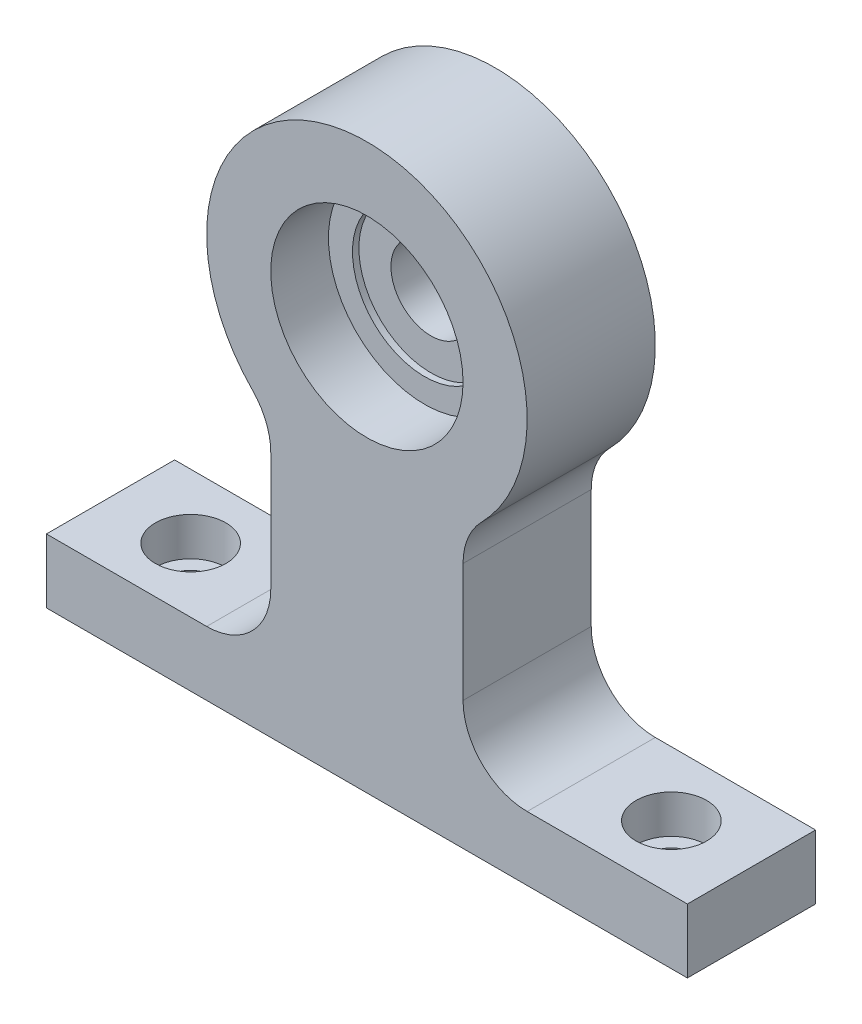
ISO-10303-21;
HEADER;
FILE_DESCRIPTION(('STEP AP214'),'2;1');
FILE_NAME('part.step','',(''),(''),'','','');
FILE_SCHEMA(('AUTOMOTIVE_DESIGN { 1 0 10303 214 1 1 1 1 }'));
ENDSEC;
DATA;
#1=APPLICATION_CONTEXT('core data for automotive mechanical design processes');
#2=APPLICATION_PROTOCOL_DEFINITION('international standard','automotive_design',2000,#1);
#3=PRODUCT_CONTEXT('',#1,'mechanical');
#4=PRODUCT('Part','Part','',(#3));
#5=PRODUCT_RELATED_PRODUCT_CATEGORY('part','',(#4));
#6=PRODUCT_DEFINITION_FORMATION('','',#4);
#7=PRODUCT_DEFINITION_CONTEXT('part definition',#1,'design');
#8=PRODUCT_DEFINITION('design','',#6,#7);
#9=PRODUCT_DEFINITION_SHAPE('','',#8);
#10=(LENGTH_UNIT() NAMED_UNIT(*) SI_UNIT(.MILLI.,.METRE.));
#11=(NAMED_UNIT(*) PLANE_ANGLE_UNIT() SI_UNIT($,.RADIAN.));
#12=(NAMED_UNIT(*) SI_UNIT($,.STERADIAN.) SOLID_ANGLE_UNIT());
#13=UNCERTAINTY_MEASURE_WITH_UNIT(LENGTH_MEASURE(1.E-05),#10,'distance_accuracy_value','');
#14=(GEOMETRIC_REPRESENTATION_CONTEXT(3) GLOBAL_UNCERTAINTY_ASSIGNED_CONTEXT((#13)) GLOBAL_UNIT_ASSIGNED_CONTEXT((#10,
#11,#12)) REPRESENTATION_CONTEXT('',''));
#15=CARTESIAN_POINT('',(0.,0.,0.));
#16=DIRECTION('',(0.,0.,1.));
#17=DIRECTION('',(1.,0.,0.));
#18=AXIS2_PLACEMENT_3D('',#15,#16,#17);
#19=CARTESIAN_POINT('',(0.,63.,0.));
#20=DIRECTION('',(0.,0.,1.));
#21=DIRECTION('',(1.,0.,0.));
#22=AXIS2_PLACEMENT_3D('',#19,#20,#21);
#23=PLANE('',#22);
#24=CARTESIAN_POINT('',(0.,63.,0.));
#25=DIRECTION('',(0.,0.,1.));
#26=DIRECTION('',(1.,0.,0.));
#27=AXIS2_PLACEMENT_3D('',#24,#25,#26);
#28=CIRCLE('',#27,6.25);
#29=CARTESIAN_POINT('',(6.25,63.,0.));
#30=VERTEX_POINT('',#29);
#31=EDGE_CURVE('E360',#30,#30,#28,.T.);
#32=ORIENTED_EDGE('',*,*,#31,.F.);
#33=EDGE_LOOP('',(#32));
#34=FACE_BOUND('',#33,.T.);
#35=CARTESIAN_POINT('',(0.,63.,0.));
#36=DIRECTION('',(0.,0.,1.));
#37=DIRECTION('',(1.,0.,0.));
#38=AXIS2_PLACEMENT_3D('',#35,#36,#37);
#39=CIRCLE('',#38,11.25);
#40=CARTESIAN_POINT('',(11.25,63.,0.));
#41=VERTEX_POINT('',#40);
#42=EDGE_CURVE('E48',#41,#41,#39,.F.);
#43=ORIENTED_EDGE('',*,*,#42,.F.);
#44=EDGE_LOOP('',(#43));
#45=FACE_BOUND('',#44,.T.);
#46=ADVANCED_FACE('F39',(#34,#45),#23,.T.);
#47=CARTESIAN_POINT('',(0.,63.,10.));
#48=DIRECTION('',(0.,0.,1.));
#49=DIRECTION('',(1.,0.,0.));
#50=AXIS2_PLACEMENT_3D('',#47,#48,#49);
#51=PLANE('',#50);
#52=DIRECTION('',(0.,-1.,0.));
#53=VECTOR('',#52,1.);
#54=CARTESIAN_POINT('',(-50.,0.,10.));
#55=LINE('',#54,#53);
#56=CARTESIAN_POINT('',(-50.,10.,10.));
#57=VERTEX_POINT('',#56);
#58=CARTESIAN_POINT('',(-50.,0.,10.));
#59=VERTEX_POINT('',#58);
#60=EDGE_CURVE('E143',#57,#59,#55,.T.);
#61=ORIENTED_EDGE('',*,*,#60,.T.);
#62=DIRECTION('',(1.,0.,0.));
#63=VECTOR('',#62,1.);
#64=CARTESIAN_POINT('',(-50.,0.,10.));
#65=LINE('',#64,#63);
#66=CARTESIAN_POINT('',(50.,0.,10.));
#67=VERTEX_POINT('',#66);
#68=EDGE_CURVE('E131',#59,#67,#65,.T.);
#69=ORIENTED_EDGE('',*,*,#68,.T.);
#70=DIRECTION('',(0.,1.,0.));
#71=VECTOR('',#70,1.);
#72=CARTESIAN_POINT('',(50.,0.,10.));
#73=LINE('',#72,#71);
#74=CARTESIAN_POINT('',(50.,10.,10.));
#75=VERTEX_POINT('',#74);
#76=EDGE_CURVE('E142',#67,#75,#73,.T.);
#77=ORIENTED_EDGE('',*,*,#76,.T.);
#78=DIRECTION('',(-1.,0.,0.));
#79=VECTOR('',#78,1.);
#80=CARTESIAN_POINT('',(15.,10.,10.));
#81=LINE('',#80,#79);
#82=CARTESIAN_POINT('',(25.,10.,10.));
#83=VERTEX_POINT('',#82);
#84=EDGE_CURVE('E330',#75,#83,#81,.T.);
#85=ORIENTED_EDGE('',*,*,#84,.T.);
#86=CARTESIAN_POINT('',(25.,20.,10.));
#87=DIRECTION('',(0.,0.,1.));
#88=DIRECTION('',(1.,0.,0.));
#89=AXIS2_PLACEMENT_3D('',#86,#87,#88);
#90=CIRCLE('',#89,10.);
#91=CARTESIAN_POINT('',(15.,20.,10.));
#92=VERTEX_POINT('',#91);
#93=EDGE_CURVE('E213',#83,#92,#90,.F.);
#94=ORIENTED_EDGE('',*,*,#93,.T.);
#95=DIRECTION('',(0.,1.,0.));
#96=VECTOR('',#95,1.);
#97=CARTESIAN_POINT('',(15.,43.,10.));
#98=LINE('',#97,#96);
#99=CARTESIAN_POINT('',(15.,38.5051025721682,10.));
#100=VERTEX_POINT('',#99);
#101=EDGE_CURVE('E336',#92,#100,#98,.T.);
#102=ORIENTED_EDGE('',*,*,#101,.T.);
#103=CARTESIAN_POINT('',(25.,38.5051025721682,10.));
#104=DIRECTION('',(0.,0.,1.));
#105=DIRECTION('',(1.,0.,0.));
#106=AXIS2_PLACEMENT_3D('',#103,#104,#105);
#107=CIRCLE('',#106,10.);
#108=CARTESIAN_POINT('',(17.8571428571429,45.5036446944059,10.));
#109=VERTEX_POINT('',#108);
#110=EDGE_CURVE('E196',#100,#109,#107,.F.);
#111=ORIENTED_EDGE('',*,*,#110,.T.);
#112=CARTESIAN_POINT('',(0.,63.,10.));
#113=DIRECTION('',(0.,0.,1.));
#114=DIRECTION('',(1.,0.,0.));
#115=AXIS2_PLACEMENT_3D('',#112,#113,#114);
#116=CIRCLE('',#115,25.);
#117=CARTESIAN_POINT('',(-17.8571428571429,45.5036446944059,10.));
#118=VERTEX_POINT('',#117);
#119=EDGE_CURVE('E298',#109,#118,#116,.T.);
#120=ORIENTED_EDGE('',*,*,#119,.T.);
#121=CARTESIAN_POINT('',(-25.,38.5051025721682,10.));
#122=DIRECTION('',(0.,0.,1.));
#123=DIRECTION('',(1.,0.,0.));
#124=AXIS2_PLACEMENT_3D('',#121,#122,#123);
#125=CIRCLE('',#124,10.);
#126=CARTESIAN_POINT('',(-15.,38.5051025721682,10.));
#127=VERTEX_POINT('',#126);
#128=EDGE_CURVE('E202',#118,#127,#125,.F.);
#129=ORIENTED_EDGE('',*,*,#128,.T.);
#130=DIRECTION('',(0.,-1.,0.));
#131=VECTOR('',#130,1.);
#132=CARTESIAN_POINT('',(-15.,43.,10.));
#133=LINE('',#132,#131);
#134=CARTESIAN_POINT('',(-15.,20.,10.));
#135=VERTEX_POINT('',#134);
#136=EDGE_CURVE('E289',#127,#135,#133,.T.);
#137=ORIENTED_EDGE('',*,*,#136,.T.);
#138=CARTESIAN_POINT('',(-25.,20.,10.));
#139=DIRECTION('',(0.,0.,1.));
#140=DIRECTION('',(1.,0.,0.));
#141=AXIS2_PLACEMENT_3D('',#138,#139,#140);
#142=CIRCLE('',#141,10.);
#143=CARTESIAN_POINT('',(-25.,10.,10.));
#144=VERTEX_POINT('',#143);
#145=EDGE_CURVE('E208',#135,#144,#142,.F.);
#146=ORIENTED_EDGE('',*,*,#145,.T.);
#147=DIRECTION('',(-1.,0.,0.));
#148=VECTOR('',#147,1.);
#149=CARTESIAN_POINT('',(-50.,10.,10.));
#150=LINE('',#149,#148);
#151=EDGE_CURVE('E149',#144,#57,#150,.T.);
#152=ORIENTED_EDGE('',*,*,#151,.T.);
#153=EDGE_LOOP('',(#61,#69,#77,#85,#94,#102,#111,#120,#129,#137,#146,#152));
#154=FACE_BOUND('',#153,.T.);
#155=CARTESIAN_POINT('',(0.,63.,10.));
#156=DIRECTION('',(0.,0.,1.));
#157=DIRECTION('',(1.,0.,0.));
#158=AXIS2_PLACEMENT_3D('',#155,#156,#157);
#159=CIRCLE('',#158,15.);
#160=CARTESIAN_POINT('',(15.,63.,10.));
#161=VERTEX_POINT('',#160);
#162=EDGE_CURVE('E305',#161,#161,#159,.T.);
#163=ORIENTED_EDGE('',*,*,#162,.F.);
#164=EDGE_LOOP('',(#163));
#165=FACE_BOUND('',#164,.T.);
#166=ADVANCED_FACE('F146',(#154,#165),#51,.T.);
#167=CARTESIAN_POINT('',(0.,63.,-10.));
#168=DIRECTION('',(0.,0.,1.));
#169=DIRECTION('',(1.,0.,0.));
#170=AXIS2_PLACEMENT_3D('',#167,#168,#169);
#171=PLANE('',#170);
#172=DIRECTION('',(0.,-1.,0.));
#173=VECTOR('',#172,1.);
#174=CARTESIAN_POINT('',(-50.,0.,-10.));
#175=LINE('',#174,#173);
#176=CARTESIAN_POINT('',(-50.,10.,-10.));
#177=VERTEX_POINT('',#176);
#178=CARTESIAN_POINT('',(-50.,0.,-10.));
#179=VERTEX_POINT('',#178);
#180=EDGE_CURVE('E158',#177,#179,#175,.T.);
#181=ORIENTED_EDGE('',*,*,#180,.F.);
#182=DIRECTION('',(-1.,0.,0.));
#183=VECTOR('',#182,1.);
#184=CARTESIAN_POINT('',(-50.,10.,-10.));
#185=LINE('',#184,#183);
#186=CARTESIAN_POINT('',(-25.,10.,-10.));
#187=VERTEX_POINT('',#186);
#188=EDGE_CURVE('E154',#187,#177,#185,.T.);
#189=ORIENTED_EDGE('',*,*,#188,.F.);
#190=CARTESIAN_POINT('',(-25.,20.,-10.));
#191=DIRECTION('',(0.,0.,1.));
#192=DIRECTION('',(1.,0.,0.));
#193=AXIS2_PLACEMENT_3D('',#190,#191,#192);
#194=CIRCLE('',#193,10.);
#195=CARTESIAN_POINT('',(-15.,20.,-10.));
#196=VERTEX_POINT('',#195);
#197=EDGE_CURVE('E205',#187,#196,#194,.T.);
#198=ORIENTED_EDGE('',*,*,#197,.T.);
#199=DIRECTION('',(0.,-1.,0.));
#200=VECTOR('',#199,1.);
#201=CARTESIAN_POINT('',(-15.,43.,-10.));
#202=LINE('',#201,#200);
#203=CARTESIAN_POINT('',(-15.,38.5051025721682,-10.));
#204=VERTEX_POINT('',#203);
#205=EDGE_CURVE('E322',#204,#196,#202,.T.);
#206=ORIENTED_EDGE('',*,*,#205,.F.);
#207=CARTESIAN_POINT('',(-25.,38.5051025721682,-10.));
#208=DIRECTION('',(0.,0.,1.));
#209=DIRECTION('',(1.,0.,0.));
#210=AXIS2_PLACEMENT_3D('',#207,#208,#209);
#211=CIRCLE('',#210,10.);
#212=CARTESIAN_POINT('',(-17.8571428571429,45.5036446944059,-10.));
#213=VERTEX_POINT('',#212);
#214=EDGE_CURVE('E199',#204,#213,#211,.T.);
#215=ORIENTED_EDGE('',*,*,#214,.T.);
#216=CARTESIAN_POINT('',(0.,63.,-10.));
#217=DIRECTION('',(0.,0.,1.));
#218=DIRECTION('',(1.,0.,0.));
#219=AXIS2_PLACEMENT_3D('',#216,#217,#218);
#220=CIRCLE('',#219,25.);
#221=CARTESIAN_POINT('',(17.8571428571429,45.5036446944059,-10.));
#222=VERTEX_POINT('',#221);
#223=EDGE_CURVE('E318',#222,#213,#220,.T.);
#224=ORIENTED_EDGE('',*,*,#223,.F.);
#225=CARTESIAN_POINT('',(25.,38.5051025721682,-10.));
#226=DIRECTION('',(0.,0.,1.));
#227=DIRECTION('',(1.,0.,0.));
#228=AXIS2_PLACEMENT_3D('',#225,#226,#227);
#229=CIRCLE('',#228,10.);
#230=CARTESIAN_POINT('',(15.,38.5051025721682,-10.));
#231=VERTEX_POINT('',#230);
#232=EDGE_CURVE('E193',#222,#231,#229,.T.);
#233=ORIENTED_EDGE('',*,*,#232,.T.);
#234=DIRECTION('',(0.,1.,0.));
#235=VECTOR('',#234,1.);
#236=CARTESIAN_POINT('',(15.,43.,-10.));
#237=LINE('',#236,#235);
#238=CARTESIAN_POINT('',(15.,20.,-10.));
#239=VERTEX_POINT('',#238);
#240=EDGE_CURVE('E314',#239,#231,#237,.T.);
#241=ORIENTED_EDGE('',*,*,#240,.F.);
#242=CARTESIAN_POINT('',(25.,20.,-10.));
#243=DIRECTION('',(0.,0.,1.));
#244=DIRECTION('',(1.,0.,0.));
#245=AXIS2_PLACEMENT_3D('',#242,#243,#244);
#246=CIRCLE('',#245,10.);
#247=CARTESIAN_POINT('',(25.,10.,-10.));
#248=VERTEX_POINT('',#247);
#249=EDGE_CURVE('E63',#239,#248,#246,.T.);
#250=ORIENTED_EDGE('',*,*,#249,.T.);
#251=DIRECTION('',(-1.,0.,0.));
#252=VECTOR('',#251,1.);
#253=CARTESIAN_POINT('',(15.,10.,-10.));
#254=LINE('',#253,#252);
#255=CARTESIAN_POINT('',(50.,10.,-10.));
#256=VERTEX_POINT('',#255);
#257=EDGE_CURVE('E311',#256,#248,#254,.T.);
#258=ORIENTED_EDGE('',*,*,#257,.F.);
#259=DIRECTION('',(0.,1.,0.));
#260=VECTOR('',#259,1.);
#261=CARTESIAN_POINT('',(50.,0.,-10.));
#262=LINE('',#261,#260);
#263=CARTESIAN_POINT('',(50.,0.,-10.));
#264=VERTEX_POINT('',#263);
#265=EDGE_CURVE('E308',#264,#256,#262,.T.);
#266=ORIENTED_EDGE('',*,*,#265,.F.);
#267=DIRECTION('',(1.,0.,0.));
#268=VECTOR('',#267,1.);
#269=CARTESIAN_POINT('',(-50.,0.,-10.));
#270=LINE('',#269,#268);
#271=EDGE_CURVE('E304',#179,#264,#270,.T.);
#272=ORIENTED_EDGE('',*,*,#271,.F.);
#273=EDGE_LOOP('',(#181,#189,#198,#206,#215,#224,#233,#241,#250,#258,#266,#272));
#274=FACE_BOUND('',#273,.T.);
#275=CARTESIAN_POINT('',(0.,63.,-10.));
#276=DIRECTION('',(0.,0.,1.));
#277=DIRECTION('',(1.,0.,0.));
#278=AXIS2_PLACEMENT_3D('',#275,#276,#277);
#279=CIRCLE('',#278,6.25);
#280=CARTESIAN_POINT('',(6.25,63.,-10.));
#281=VERTEX_POINT('',#280);
#282=EDGE_CURVE('E359',#281,#281,#279,.T.);
#283=ORIENTED_EDGE('',*,*,#282,.T.);
#284=EDGE_LOOP('',(#283));
#285=FACE_BOUND('',#284,.T.);
#286=ADVANCED_FACE('F227',(#274,#285),#171,.F.);
#287=CARTESIAN_POINT('',(-50.,0.,10.));
#288=DIRECTION('',(1.,0.,0.));
#289=DIRECTION('',(0.,0.,-1.));
#290=AXIS2_PLACEMENT_3D('',#287,#288,#289);
#291=PLANE('',#290);
#292=ORIENTED_EDGE('',*,*,#180,.T.);
#293=DIRECTION('',(0.,0.,-1.));
#294=VECTOR('',#293,1.);
#295=CARTESIAN_POINT('',(-50.,0.,10.));
#296=LINE('',#295,#294);
#297=EDGE_CURVE('E135',#59,#179,#296,.T.);
#298=ORIENTED_EDGE('',*,*,#297,.F.);
#299=ORIENTED_EDGE('',*,*,#60,.F.);
#300=DIRECTION('',(0.,0.,-1.));
#301=VECTOR('',#300,1.);
#302=CARTESIAN_POINT('',(-50.,10.,10.));
#303=LINE('',#302,#301);
#304=EDGE_CURVE('E292',#57,#177,#303,.T.);
#305=ORIENTED_EDGE('',*,*,#304,.T.);
#306=EDGE_LOOP('',(#292,#298,#299,#305));
#307=FACE_BOUND('',#306,.T.);
#308=ADVANCED_FACE('F156',(#307),#291,.F.);
#309=CARTESIAN_POINT('',(-50.,0.,10.));
#310=DIRECTION('',(0.,1.,0.));
#311=DIRECTION('',(-1.,0.,0.));
#312=AXIS2_PLACEMENT_3D('',#309,#310,#311);
#313=PLANE('',#312);
#314=CARTESIAN_POINT('',(-37.5,0.,0.));
#315=DIRECTION('',(0.,1.,0.));
#316=DIRECTION('',(0.,0.,1.));
#317=AXIS2_PLACEMENT_3D('',#314,#315,#316);
#318=CIRCLE('',#317,3.3);
#319=CARTESIAN_POINT('',(-37.5,0.,3.3));
#320=VERTEX_POINT('',#319);
#321=EDGE_CURVE('E383',#320,#320,#318,.T.);
#322=ORIENTED_EDGE('',*,*,#321,.T.);
#323=EDGE_LOOP('',(#322));
#324=FACE_BOUND('',#323,.T.);
#325=CARTESIAN_POINT('',(37.5,0.,0.));
#326=DIRECTION('',(0.,1.,0.));
#327=DIRECTION('',(0.,0.,1.));
#328=AXIS2_PLACEMENT_3D('',#325,#326,#327);
#329=CIRCLE('',#328,3.3);
#330=CARTESIAN_POINT('',(37.5,0.,3.3));
#331=VERTEX_POINT('',#330);
#332=EDGE_CURVE('E364',#331,#331,#329,.T.);
#333=ORIENTED_EDGE('',*,*,#332,.T.);
#334=EDGE_LOOP('',(#333));
#335=FACE_BOUND('',#334,.T.);
#336=ORIENTED_EDGE('',*,*,#271,.T.);
#337=DIRECTION('',(0.,0.,-1.));
#338=VECTOR('',#337,1.);
#339=CARTESIAN_POINT('',(50.,0.,10.));
#340=LINE('',#339,#338);
#341=EDGE_CURVE('E138',#67,#264,#340,.T.);
#342=ORIENTED_EDGE('',*,*,#341,.F.);
#343=ORIENTED_EDGE('',*,*,#68,.F.);
#344=ORIENTED_EDGE('',*,*,#297,.T.);
#345=EDGE_LOOP('',(#336,#342,#343,#344));
#346=FACE_BOUND('',#345,.T.);
#347=ADVANCED_FACE('F133',(#324,#335,#346),#313,.F.);
#348=CARTESIAN_POINT('',(50.,0.,10.));
#349=DIRECTION('',(-1.,0.,0.));
#350=DIRECTION('',(0.,0.,1.));
#351=AXIS2_PLACEMENT_3D('',#348,#349,#350);
#352=PLANE('',#351);
#353=ORIENTED_EDGE('',*,*,#265,.T.);
#354=DIRECTION('',(0.,0.,-1.));
#355=VECTOR('',#354,1.);
#356=CARTESIAN_POINT('',(50.,10.,10.));
#357=LINE('',#356,#355);
#358=EDGE_CURVE('E166',#75,#256,#357,.T.);
#359=ORIENTED_EDGE('',*,*,#358,.F.);
#360=ORIENTED_EDGE('',*,*,#76,.F.);
#361=ORIENTED_EDGE('',*,*,#341,.T.);
#362=EDGE_LOOP('',(#353,#359,#360,#361));
#363=FACE_BOUND('',#362,.T.);
#364=ADVANCED_FACE('F259',(#363),#352,.F.);
#365=CARTESIAN_POINT('',(15.,10.,10.));
#366=DIRECTION('',(0.,-1.,0.));
#367=DIRECTION('',(0.,0.,-1.));
#368=AXIS2_PLACEMENT_3D('',#365,#366,#367);
#369=PLANE('',#368);
#370=CARTESIAN_POINT('',(37.5,10.,0.));
#371=DIRECTION('',(0.,1.,0.));
#372=DIRECTION('',(0.,0.,1.));
#373=AXIS2_PLACEMENT_3D('',#370,#371,#372);
#374=CIRCLE('',#373,5.49999999999999);
#375=CARTESIAN_POINT('',(37.5,10.,5.49999999999999));
#376=VERTEX_POINT('',#375);
#377=EDGE_CURVE('E379',#376,#376,#374,.T.);
#378=ORIENTED_EDGE('',*,*,#377,.F.);
#379=EDGE_LOOP('',(#378));
#380=FACE_BOUND('',#379,.T.);
#381=ORIENTED_EDGE('',*,*,#257,.T.);
#382=DIRECTION('',(0.,0.,-1.));
#383=VECTOR('',#382,1.);
#384=CARTESIAN_POINT('',(25.,10.,10.));
#385=LINE('',#384,#383);
#386=EDGE_CURVE('E55',#248,#83,#385,.F.);
#387=ORIENTED_EDGE('',*,*,#386,.T.);
#388=ORIENTED_EDGE('',*,*,#84,.F.);
#389=ORIENTED_EDGE('',*,*,#358,.T.);
#390=EDGE_LOOP('',(#381,#387,#388,#389));
#391=FACE_BOUND('',#390,.T.);
#392=ADVANCED_FACE('F255',(#380,#391),#369,.F.);
#393=CARTESIAN_POINT('',(15.,43.,10.));
#394=DIRECTION('',(-1.,0.,0.));
#395=DIRECTION('',(0.,-1.,0.));
#396=AXIS2_PLACEMENT_3D('',#393,#394,#395);
#397=PLANE('',#396);
#398=ORIENTED_EDGE('',*,*,#240,.T.);
#399=DIRECTION('',(0.,0.,1.));
#400=VECTOR('',#399,1.);
#401=CARTESIAN_POINT('',(15.,38.5051025721682,10.));
#402=LINE('',#401,#400);
#403=EDGE_CURVE('E177',#231,#100,#402,.T.);
#404=ORIENTED_EDGE('',*,*,#403,.T.);
#405=ORIENTED_EDGE('',*,*,#101,.F.);
#406=DIRECTION('',(0.,0.,-1.));
#407=VECTOR('',#406,1.);
#408=CARTESIAN_POINT('',(15.,20.,-10.));
#409=LINE('',#408,#407);
#410=EDGE_CURVE('E173',#92,#239,#409,.T.);
#411=ORIENTED_EDGE('',*,*,#410,.T.);
#412=EDGE_LOOP('',(#398,#404,#405,#411));
#413=FACE_BOUND('',#412,.T.);
#414=ADVANCED_FACE('F251',(#413),#397,.F.);
#415=CARTESIAN_POINT('',(0.,63.,10.));
#416=DIRECTION('',(0.,0.,-1.));
#417=DIRECTION('',(-1.,0.,0.));
#418=AXIS2_PLACEMENT_3D('',#415,#416,#417);
#419=CYLINDRICAL_SURFACE('',#418,25.);
#420=ORIENTED_EDGE('',*,*,#119,.F.);
#421=DIRECTION('',(0.,0.,-1.));
#422=VECTOR('',#421,1.);
#423=CARTESIAN_POINT('',(17.8571428571429,45.5036446944059,10.));
#424=LINE('',#423,#422);
#425=EDGE_CURVE('E164',#109,#222,#424,.T.);
#426=ORIENTED_EDGE('',*,*,#425,.T.);
#427=ORIENTED_EDGE('',*,*,#223,.T.);
#428=DIRECTION('',(0.,0.,-1.));
#429=VECTOR('',#428,1.);
#430=CARTESIAN_POINT('',(-17.8571428571429,45.5036446944059,10.));
#431=LINE('',#430,#429);
#432=EDGE_CURVE('E160',#213,#118,#431,.F.);
#433=ORIENTED_EDGE('',*,*,#432,.T.);
#434=EDGE_LOOP('',(#420,#426,#427,#433));
#435=FACE_BOUND('',#434,.T.);
#436=ADVANCED_FACE('F247',(#435),#419,.T.);
#437=CARTESIAN_POINT('',(-15.,43.,10.));
#438=DIRECTION('',(1.,0.,0.));
#439=DIRECTION('',(0.,1.,0.));
#440=AXIS2_PLACEMENT_3D('',#437,#438,#439);
#441=PLANE('',#440);
#442=ORIENTED_EDGE('',*,*,#136,.F.);
#443=DIRECTION('',(0.,0.,1.));
#444=VECTOR('',#443,1.);
#445=CARTESIAN_POINT('',(-15.,38.5051025721682,-10.));
#446=LINE('',#445,#444);
#447=EDGE_CURVE('E183',#127,#204,#446,.F.);
#448=ORIENTED_EDGE('',*,*,#447,.T.);
#449=ORIENTED_EDGE('',*,*,#205,.T.);
#450=DIRECTION('',(0.,0.,-1.));
#451=VECTOR('',#450,1.);
#452=CARTESIAN_POINT('',(-15.,20.,10.));
#453=LINE('',#452,#451);
#454=EDGE_CURVE('E180',#196,#135,#453,.F.);
#455=ORIENTED_EDGE('',*,*,#454,.T.);
#456=EDGE_LOOP('',(#442,#448,#449,#455));
#457=FACE_BOUND('',#456,.T.);
#458=ADVANCED_FACE('F243',(#457),#441,.F.);
#459=CARTESIAN_POINT('',(-50.,10.,10.));
#460=DIRECTION('',(0.,-1.,0.));
#461=DIRECTION('',(1.,0.,0.));
#462=AXIS2_PLACEMENT_3D('',#459,#460,#461);
#463=PLANE('',#462);
#464=CARTESIAN_POINT('',(-37.5,10.,0.));
#465=DIRECTION('',(0.,1.,0.));
#466=DIRECTION('',(0.,0.,1.));
#467=AXIS2_PLACEMENT_3D('',#464,#465,#466);
#468=CIRCLE('',#467,5.49999999999999);
#469=CARTESIAN_POINT('',(-37.5,10.,5.49999999999999));
#470=VERTEX_POINT('',#469);
#471=EDGE_CURVE('E395',#470,#470,#468,.T.);
#472=ORIENTED_EDGE('',*,*,#471,.F.);
#473=EDGE_LOOP('',(#472));
#474=FACE_BOUND('',#473,.T.);
#475=ORIENTED_EDGE('',*,*,#151,.F.);
#476=DIRECTION('',(0.,0.,-1.));
#477=VECTOR('',#476,1.);
#478=CARTESIAN_POINT('',(-25.,10.,-10.));
#479=LINE('',#478,#477);
#480=EDGE_CURVE('E187',#144,#187,#479,.T.);
#481=ORIENTED_EDGE('',*,*,#480,.T.);
#482=ORIENTED_EDGE('',*,*,#188,.T.);
#483=ORIENTED_EDGE('',*,*,#304,.F.);
#484=EDGE_LOOP('',(#475,#481,#482,#483));
#485=FACE_BOUND('',#484,.T.);
#486=ADVANCED_FACE('F236',(#474,#485),#463,.F.);
#487=CARTESIAN_POINT('',(0.,63.,10.));
#488=DIRECTION('',(0.,0.,-1.));
#489=DIRECTION('',(-1.,0.,0.));
#490=AXIS2_PLACEMENT_3D('',#487,#488,#489);
#491=CYLINDRICAL_SURFACE('',#490,15.);
#492=CARTESIAN_POINT('',(0.,63.,0.999999999999999));
#493=DIRECTION('',(0.,0.,1.));
#494=DIRECTION('',(1.,0.,0.));
#495=AXIS2_PLACEMENT_3D('',#492,#493,#494);
#496=CIRCLE('',#495,15.);
#497=CARTESIAN_POINT('',(15.,63.,0.999999999999999));
#498=VERTEX_POINT('',#497);
#499=EDGE_CURVE('E11',#498,#498,#496,.T.);
#500=ORIENTED_EDGE('',*,*,#499,.F.);
#501=EDGE_LOOP('',(#500));
#502=FACE_BOUND('',#501,.T.);
#503=ORIENTED_EDGE('',*,*,#162,.T.);
#504=EDGE_LOOP('',(#503));
#505=FACE_BOUND('',#504,.T.);
#506=ADVANCED_FACE('F234',(#502,#505),#491,.F.);
#507=CARTESIAN_POINT('',(0.,63.,-10.));
#508=DIRECTION('',(0.,0.,1.));
#509=DIRECTION('',(1.,0.,0.));
#510=AXIS2_PLACEMENT_3D('',#507,#508,#509);
#511=CYLINDRICAL_SURFACE('',#510,6.25);
#512=ORIENTED_EDGE('',*,*,#282,.F.);
#513=EDGE_LOOP('',(#512));
#514=FACE_BOUND('',#513,.T.);
#515=ORIENTED_EDGE('',*,*,#31,.T.);
#516=EDGE_LOOP('',(#515));
#517=FACE_BOUND('',#516,.T.);
#518=ADVANCED_FACE('F232',(#514,#517),#511,.F.);
#519=CARTESIAN_POINT('',(25.,38.5051025721682,10.));
#520=DIRECTION('',(0.,0.,-1.));
#521=DIRECTION('',(-1.,0.,0.));
#522=AXIS2_PLACEMENT_3D('',#519,#520,#521);
#523=CYLINDRICAL_SURFACE('',#522,10.);
#524=ORIENTED_EDGE('',*,*,#110,.F.);
#525=ORIENTED_EDGE('',*,*,#403,.F.);
#526=ORIENTED_EDGE('',*,*,#232,.F.);
#527=ORIENTED_EDGE('',*,*,#425,.F.);
#528=EDGE_LOOP('',(#524,#525,#526,#527));
#529=FACE_BOUND('',#528,.T.);
#530=ADVANCED_FACE('F269',(#529),#523,.F.);
#531=CARTESIAN_POINT('',(-25.,38.5051025721682,10.));
#532=DIRECTION('',(0.,0.,-1.));
#533=DIRECTION('',(-1.,0.,0.));
#534=AXIS2_PLACEMENT_3D('',#531,#532,#533);
#535=CYLINDRICAL_SURFACE('',#534,10.);
#536=ORIENTED_EDGE('',*,*,#128,.F.);
#537=ORIENTED_EDGE('',*,*,#432,.F.);
#538=ORIENTED_EDGE('',*,*,#214,.F.);
#539=ORIENTED_EDGE('',*,*,#447,.F.);
#540=EDGE_LOOP('',(#536,#537,#538,#539));
#541=FACE_BOUND('',#540,.T.);
#542=ADVANCED_FACE('F272',(#541),#535,.F.);
#543=CARTESIAN_POINT('',(-25.,20.,10.));
#544=DIRECTION('',(0.,0.,1.));
#545=DIRECTION('',(1.,0.,0.));
#546=AXIS2_PLACEMENT_3D('',#543,#544,#545);
#547=CYLINDRICAL_SURFACE('',#546,10.);
#548=ORIENTED_EDGE('',*,*,#145,.F.);
#549=ORIENTED_EDGE('',*,*,#454,.F.);
#550=ORIENTED_EDGE('',*,*,#197,.F.);
#551=ORIENTED_EDGE('',*,*,#480,.F.);
#552=EDGE_LOOP('',(#548,#549,#550,#551));
#553=FACE_BOUND('',#552,.T.);
#554=ADVANCED_FACE('F275',(#553),#547,.F.);
#555=CARTESIAN_POINT('',(25.,20.,10.));
#556=DIRECTION('',(0.,0.,1.));
#557=DIRECTION('',(1.,0.,0.));
#558=AXIS2_PLACEMENT_3D('',#555,#556,#557);
#559=CYLINDRICAL_SURFACE('',#558,10.);
#560=ORIENTED_EDGE('',*,*,#93,.F.);
#561=ORIENTED_EDGE('',*,*,#386,.F.);
#562=ORIENTED_EDGE('',*,*,#249,.F.);
#563=ORIENTED_EDGE('',*,*,#410,.F.);
#564=EDGE_LOOP('',(#560,#561,#562,#563));
#565=FACE_BOUND('',#564,.T.);
#566=ADVANCED_FACE('F41',(#565),#559,.F.);
#567=CARTESIAN_POINT('',(37.5,10.,0.));
#568=DIRECTION('',(0.,1.,0.));
#569=DIRECTION('',(0.,0.,1.));
#570=AXIS2_PLACEMENT_3D('',#567,#568,#569);
#571=CYLINDRICAL_SURFACE('',#570,3.3);
#572=ORIENTED_EDGE('',*,*,#332,.F.);
#573=EDGE_LOOP('',(#572));
#574=FACE_BOUND('',#573,.T.);
#575=CARTESIAN_POINT('',(37.5,4.00000000000005,0.));
#576=DIRECTION('',(0.,1.,0.));
#577=DIRECTION('',(0.,0.,1.));
#578=AXIS2_PLACEMENT_3D('',#575,#576,#577);
#579=CIRCLE('',#578,3.3);
#580=CARTESIAN_POINT('',(37.5,4.00000000000005,3.3));
#581=VERTEX_POINT('',#580);
#582=EDGE_CURVE('E371',#581,#581,#579,.T.);
#583=ORIENTED_EDGE('',*,*,#582,.T.);
#584=EDGE_LOOP('',(#583));
#585=FACE_BOUND('',#584,.T.);
#586=ADVANCED_FACE('F282',(#574,#585),#571,.F.);
#587=CARTESIAN_POINT('',(40.8,4.00000000000005,0.));
#588=DIRECTION('',(0.,-1.,0.));
#589=DIRECTION('',(0.,0.,-1.));
#590=AXIS2_PLACEMENT_3D('',#587,#588,#589);
#591=PLANE('',#590);
#592=ORIENTED_EDGE('',*,*,#582,.F.);
#593=EDGE_LOOP('',(#592));
#594=FACE_BOUND('',#593,.T.);
#595=CARTESIAN_POINT('',(37.5,4.00000000000005,0.));
#596=DIRECTION('',(0.,1.,0.));
#597=DIRECTION('',(0.,0.,1.));
#598=AXIS2_PLACEMENT_3D('',#595,#596,#597);
#599=CIRCLE('',#598,5.5);
#600=CARTESIAN_POINT('',(37.5,4.00000000000005,5.5));
#601=VERTEX_POINT('',#600);
#602=EDGE_CURVE('E375',#601,#601,#599,.T.);
#603=ORIENTED_EDGE('',*,*,#602,.T.);
#604=EDGE_LOOP('',(#603));
#605=FACE_BOUND('',#604,.T.);
#606=ADVANCED_FACE('F429',(#594,#605),#591,.F.);
#607=CARTESIAN_POINT('',(37.5,10.,0.));
#608=DIRECTION('',(0.,1.,0.));
#609=DIRECTION('',(0.,0.,1.));
#610=AXIS2_PLACEMENT_3D('',#607,#608,#609);
#611=CYLINDRICAL_SURFACE('',#610,5.49999999999999);
#612=ORIENTED_EDGE('',*,*,#602,.F.);
#613=EDGE_LOOP('',(#612));
#614=FACE_BOUND('',#613,.T.);
#615=ORIENTED_EDGE('',*,*,#377,.T.);
#616=EDGE_LOOP('',(#615));
#617=FACE_BOUND('',#616,.T.);
#618=ADVANCED_FACE('F425',(#614,#617),#611,.F.);
#619=CARTESIAN_POINT('',(-37.5,10.,0.));
#620=DIRECTION('',(0.,1.,0.));
#621=DIRECTION('',(0.,0.,1.));
#622=AXIS2_PLACEMENT_3D('',#619,#620,#621);
#623=CYLINDRICAL_SURFACE('',#622,3.3);
#624=ORIENTED_EDGE('',*,*,#321,.F.);
#625=EDGE_LOOP('',(#624));
#626=FACE_BOUND('',#625,.T.);
#627=CARTESIAN_POINT('',(-37.5,4.00000000000001,0.));
#628=DIRECTION('',(0.,1.,0.));
#629=DIRECTION('',(0.,0.,1.));
#630=AXIS2_PLACEMENT_3D('',#627,#628,#629);
#631=CIRCLE('',#630,3.3);
#632=CARTESIAN_POINT('',(-37.5,4.00000000000001,3.3));
#633=VERTEX_POINT('',#632);
#634=EDGE_CURVE('E387',#633,#633,#631,.T.);
#635=ORIENTED_EDGE('',*,*,#634,.T.);
#636=EDGE_LOOP('',(#635));
#637=FACE_BOUND('',#636,.T.);
#638=ADVANCED_FACE('F421',(#626,#637),#623,.F.);
#639=CARTESIAN_POINT('',(-34.2,4.00000000000001,0.));
#640=DIRECTION('',(0.,-1.,0.));
#641=DIRECTION('',(0.,0.,-1.));
#642=AXIS2_PLACEMENT_3D('',#639,#640,#641);
#643=PLANE('',#642);
#644=ORIENTED_EDGE('',*,*,#634,.F.);
#645=EDGE_LOOP('',(#644));
#646=FACE_BOUND('',#645,.T.);
#647=CARTESIAN_POINT('',(-37.5,4.00000000000001,0.));
#648=DIRECTION('',(0.,1.,0.));
#649=DIRECTION('',(0.,0.,1.));
#650=AXIS2_PLACEMENT_3D('',#647,#648,#649);
#651=CIRCLE('',#650,5.5);
#652=CARTESIAN_POINT('',(-37.5,4.00000000000001,5.5));
#653=VERTEX_POINT('',#652);
#654=EDGE_CURVE('E391',#653,#653,#651,.T.);
#655=ORIENTED_EDGE('',*,*,#654,.T.);
#656=EDGE_LOOP('',(#655));
#657=FACE_BOUND('',#656,.T.);
#658=ADVANCED_FACE('F415',(#646,#657),#643,.F.);
#659=CARTESIAN_POINT('',(-37.5,10.,0.));
#660=DIRECTION('',(0.,1.,0.));
#661=DIRECTION('',(0.,0.,1.));
#662=AXIS2_PLACEMENT_3D('',#659,#660,#661);
#663=CYLINDRICAL_SURFACE('',#662,5.49999999999999);
#664=ORIENTED_EDGE('',*,*,#654,.F.);
#665=EDGE_LOOP('',(#664));
#666=FACE_BOUND('',#665,.T.);
#667=ORIENTED_EDGE('',*,*,#471,.T.);
#668=EDGE_LOOP('',(#667));
#669=FACE_BOUND('',#668,.T.);
#670=ADVANCED_FACE('F407',(#666,#669),#663,.F.);
#671=CARTESIAN_POINT('',(0.,63.,1.));
#672=DIRECTION('',(0.,0.,1.));
#673=DIRECTION('',(1.,0.,0.));
#674=AXIS2_PLACEMENT_3D('',#671,#672,#673);
#675=PLANE('',#674);
#676=ORIENTED_EDGE('',*,*,#499,.T.);
#677=EDGE_LOOP('',(#676));
#678=FACE_BOUND('',#677,.T.);
#679=CARTESIAN_POINT('',(0.,63.,1.));
#680=DIRECTION('',(0.,0.,1.));
#681=DIRECTION('',(1.,0.,0.));
#682=AXIS2_PLACEMENT_3D('',#679,#680,#681);
#683=CIRCLE('',#682,11.25);
#684=CARTESIAN_POINT('',(11.25,63.,1.));
#685=VERTEX_POINT('',#684);
#686=EDGE_CURVE('E399',#685,#685,#683,.T.);
#687=ORIENTED_EDGE('',*,*,#686,.F.);
#688=EDGE_LOOP('',(#687));
#689=FACE_BOUND('',#688,.T.);
#690=ADVANCED_FACE('F405',(#678,#689),#675,.T.);
#691=CARTESIAN_POINT('',(0.,63.,1.));
#692=DIRECTION('',(0.,0.,-1.));
#693=DIRECTION('',(-1.,0.,0.));
#694=AXIS2_PLACEMENT_3D('',#691,#692,#693);
#695=CYLINDRICAL_SURFACE('',#694,11.25);
#696=ORIENTED_EDGE('',*,*,#686,.T.);
#697=EDGE_LOOP('',(#696));
#698=FACE_BOUND('',#697,.T.);
#699=ORIENTED_EDGE('',*,*,#42,.T.);
#700=EDGE_LOOP('',(#699));
#701=FACE_BOUND('',#700,.T.);
#702=ADVANCED_FACE('F219',(#698,#701),#695,.F.);
#703=CLOSED_SHELL('',(#46,#166,#286,#308,#347,#364,#392,#414,#436,#458,#486,#506,#518,#530,#542,
#554,#566,#586,#606,#618,#638,#658,#670,#690,#702));
#704=MANIFOLD_SOLID_BREP('B2',#703);
#705=ADVANCED_BREP_SHAPE_REPRESENTATION('',(#18,#704),#14);
#706=SHAPE_DEFINITION_REPRESENTATION(#9,#705);
ENDSEC;
END-ISO-10303-21;
